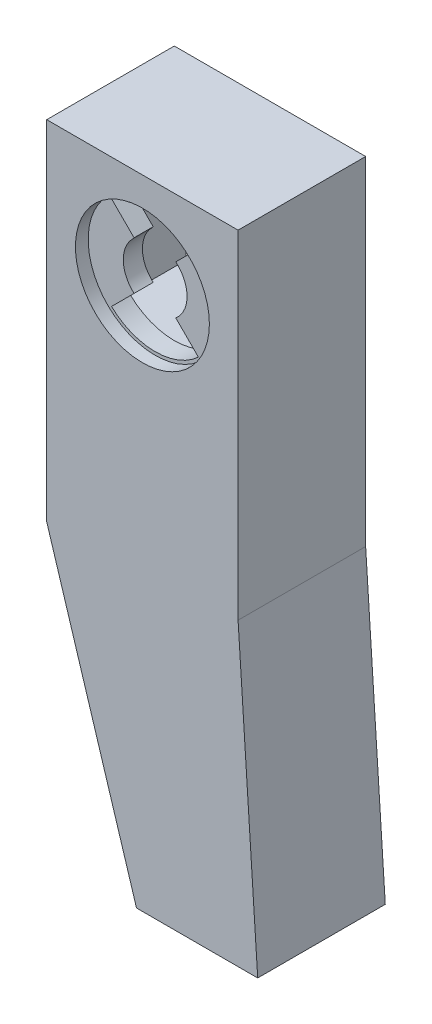
ISO-10303-21;
HEADER;
FILE_DESCRIPTION(('STEP AP214'),'2;1');
FILE_NAME('part.step','',(''),(''),'','','');
FILE_SCHEMA(('AUTOMOTIVE_DESIGN { 1 0 10303 214 1 1 1 1 }'));
ENDSEC;
DATA;
#1=APPLICATION_CONTEXT('core data for automotive mechanical design processes');
#2=APPLICATION_PROTOCOL_DEFINITION('international standard','automotive_design',2000,#1);
#3=PRODUCT_CONTEXT('',#1,'mechanical');
#4=PRODUCT('Part','Part','',(#3));
#5=PRODUCT_RELATED_PRODUCT_CATEGORY('part','',(#4));
#6=PRODUCT_DEFINITION_FORMATION('','',#4);
#7=PRODUCT_DEFINITION_CONTEXT('part definition',#1,'design');
#8=PRODUCT_DEFINITION('design','',#6,#7);
#9=PRODUCT_DEFINITION_SHAPE('','',#8);
#10=(LENGTH_UNIT() NAMED_UNIT(*) SI_UNIT(.MILLI.,.METRE.));
#11=(NAMED_UNIT(*) PLANE_ANGLE_UNIT() SI_UNIT($,.RADIAN.));
#12=(NAMED_UNIT(*) SI_UNIT($,.STERADIAN.) SOLID_ANGLE_UNIT());
#13=UNCERTAINTY_MEASURE_WITH_UNIT(LENGTH_MEASURE(1.E-05),#10,'distance_accuracy_value','');
#14=(GEOMETRIC_REPRESENTATION_CONTEXT(3) GLOBAL_UNCERTAINTY_ASSIGNED_CONTEXT((#13)) GLOBAL_UNIT_ASSIGNED_CONTEXT((#10,
#11,#12)) REPRESENTATION_CONTEXT('',''));
#15=CARTESIAN_POINT('',(0.,0.,0.));
#16=DIRECTION('',(0.,0.,1.));
#17=DIRECTION('',(1.,0.,0.));
#18=AXIS2_PLACEMENT_3D('',#15,#16,#17);
#19=CARTESIAN_POINT('',(-80.192523703358,-80.1925237033575,-5.));
#20=DIRECTION('',(-0.70710678118655,-0.707106781186545,0.));
#21=DIRECTION('',(0.707106781186545,-0.70710678118655,0.));
#22=AXIS2_PLACEMENT_3D('',#19,#20,#21);
#23=PLANE('',#22);
#24=DIRECTION('',(0.,0.,1.));
#25=VECTOR('',#24,1.);
#26=CARTESIAN_POINT('',(-167.861898306231,7.47685089951611,-5.));
#27=LINE('',#26,#25);
#28=CARTESIAN_POINT('',(-167.861898306231,7.47685089951611,-5.));
#29=VERTEX_POINT('',#28);
#30=CARTESIAN_POINT('',(-167.861898306231,7.47685089951611,-2.));
#31=VERTEX_POINT('',#30);
#32=EDGE_CURVE('E192',#29,#31,#27,.T.);
#33=ORIENTED_EDGE('',*,*,#32,.T.);
#34=DIRECTION('',(0.707106781186545,-0.70710678118655,0.));
#35=VECTOR('',#34,1.);
#36=CARTESIAN_POINT('',(-80.192523703358,-80.1925237033575,-2.));
#37=LINE('',#36,#35);
#38=CARTESIAN_POINT('',(-171.403251305948,11.0182038992326,-2.));
#39=VERTEX_POINT('',#38);
#40=EDGE_CURVE('E56',#39,#31,#37,.T.);
#41=ORIENTED_EDGE('',*,*,#40,.F.);
#42=DIRECTION('',(0.,0.,1.));
#43=VECTOR('',#42,1.);
#44=CARTESIAN_POINT('',(-171.403251305948,11.0182038992326,-5.));
#45=LINE('',#44,#43);
#46=CARTESIAN_POINT('',(-171.403251305948,11.0182038992326,-5.));
#47=VERTEX_POINT('',#46);
#48=EDGE_CURVE('E232',#47,#39,#45,.T.);
#49=ORIENTED_EDGE('',*,*,#48,.F.);
#50=DIRECTION('',(0.707106781186545,-0.70710678118655,0.));
#51=VECTOR('',#50,1.);
#52=CARTESIAN_POINT('',(-80.192523703358,-80.1925237033575,-5.));
#53=LINE('',#52,#51);
#54=EDGE_CURVE('E599',#47,#29,#53,.T.);
#55=ORIENTED_EDGE('',*,*,#54,.T.);
#56=EDGE_LOOP('',(#33,#41,#49,#55));
#57=FACE_BOUND('',#56,.T.);
#58=ADVANCED_FACE('F39',(#57),#23,.T.);
#59=CARTESIAN_POINT('',(-174.640703898861,14.8285714285714,-5.));
#60=DIRECTION('',(0.,0.,1.));
#61=DIRECTION('',(1.,0.,0.));
#62=AXIS2_PLACEMENT_3D('',#59,#60,#61);
#63=CYLINDRICAL_SURFACE('',#62,5.);
#64=ORIENTED_EDGE('',*,*,#48,.T.);
#65=CARTESIAN_POINT('',(-174.640703898861,14.8285714285714,-2.));
#66=DIRECTION('',(0.,0.,1.));
#67=DIRECTION('',(1.,0.,0.));
#68=AXIS2_PLACEMENT_3D('',#65,#66,#67);
#69=CIRCLE('',#68,5.);
#70=CARTESIAN_POINT('',(-171.403251305947,18.6389389579103,-2.));
#71=VERTEX_POINT('',#70);
#72=EDGE_CURVE('E586',#71,#39,#69,.F.);
#73=ORIENTED_EDGE('',*,*,#72,.F.);
#74=DIRECTION('',(0.,0.,1.));
#75=VECTOR('',#74,1.);
#76=CARTESIAN_POINT('',(-171.403251305947,18.6389389579103,-5.));
#77=LINE('',#76,#75);
#78=CARTESIAN_POINT('',(-171.403251305947,18.6389389579103,-5.));
#79=VERTEX_POINT('',#78);
#80=EDGE_CURVE('E623',#79,#71,#77,.T.);
#81=ORIENTED_EDGE('',*,*,#80,.F.);
#82=CARTESIAN_POINT('',(-174.640703898861,14.8285714285714,-5.));
#83=DIRECTION('',(0.,0.,1.));
#84=DIRECTION('',(1.,0.,0.));
#85=AXIS2_PLACEMENT_3D('',#82,#83,#84);
#86=CIRCLE('',#85,5.);
#87=EDGE_CURVE('E196',#79,#47,#86,.F.);
#88=ORIENTED_EDGE('',*,*,#87,.T.);
#89=EDGE_LOOP('',(#64,#73,#81,#88));
#90=FACE_BOUND('',#89,.T.);
#91=ADVANCED_FACE('F296',(#90),#63,.F.);
#92=CARTESIAN_POINT('',(-95.0210951319294,95.0210951319288,-5.));
#93=DIRECTION('',(0.70710678118655,-0.707106781186546,0.));
#94=DIRECTION('',(0.707106781186546,0.70710678118655,0.));
#95=AXIS2_PLACEMENT_3D('',#92,#93,#94);
#96=PLANE('',#95);
#97=DIRECTION('',(0.707106781186546,0.70710678118655,0.));
#98=VECTOR('',#97,1.);
#99=CARTESIAN_POINT('',(-95.0210951319294,95.0210951319288,-2.));
#100=LINE('',#99,#98);
#101=CARTESIAN_POINT('',(-167.861898306231,22.1802919576267,-2.));
#102=VERTEX_POINT('',#101);
#103=EDGE_CURVE('E583',#71,#102,#100,.T.);
#104=ORIENTED_EDGE('',*,*,#103,.T.);
#105=DIRECTION('',(0.,0.,1.));
#106=VECTOR('',#105,1.);
#107=CARTESIAN_POINT('',(-167.861898306231,22.1802919576267,-5.));
#108=LINE('',#107,#106);
#109=CARTESIAN_POINT('',(-167.861898306231,22.1802919576267,-5.));
#110=VERTEX_POINT('',#109);
#111=EDGE_CURVE('E626',#110,#102,#108,.T.);
#112=ORIENTED_EDGE('',*,*,#111,.F.);
#113=DIRECTION('',(0.707106781186546,0.70710678118655,0.));
#114=VECTOR('',#113,1.);
#115=CARTESIAN_POINT('',(-95.0210951319294,95.0210951319288,-5.));
#116=LINE('',#115,#114);
#117=EDGE_CURVE('E617',#79,#110,#116,.T.);
#118=ORIENTED_EDGE('',*,*,#117,.F.);
#119=ORIENTED_EDGE('',*,*,#80,.T.);
#120=EDGE_LOOP('',(#104,#112,#118,#119));
#121=FACE_BOUND('',#120,.T.);
#122=ADVANCED_FACE('F302',(#121),#96,.F.);
#123=CARTESIAN_POINT('',(-174.640703898861,14.8285714285714,-5.));
#124=DIRECTION('',(0.,0.,1.));
#125=DIRECTION('',(1.,0.,0.));
#126=AXIS2_PLACEMENT_3D('',#123,#124,#125);
#127=CYLINDRICAL_SURFACE('',#126,9.99999999999999);
#128=ORIENTED_EDGE('',*,*,#111,.T.);
#129=CARTESIAN_POINT('',(-174.640703898861,14.8285714285714,-2.));
#130=DIRECTION('',(0.,0.,1.));
#131=DIRECTION('',(1.,0.,0.));
#132=AXIS2_PLACEMENT_3D('',#129,#130,#131);
#133=CIRCLE('',#132,9.99999999999999);
#134=CARTESIAN_POINT('',(-181.456415011949,22.1460902719308,-2.));
#135=VERTEX_POINT('',#134);
#136=EDGE_CURVE('E581',#135,#102,#133,.F.);
#137=ORIENTED_EDGE('',*,*,#136,.F.);
#138=DIRECTION('',(0.,0.,1.));
#139=VECTOR('',#138,1.);
#140=CARTESIAN_POINT('',(-181.456415011949,22.1460902719308,-5.));
#141=LINE('',#140,#139);
#142=CARTESIAN_POINT('',(-181.456415011949,22.1460902719308,-5.));
#143=VERTEX_POINT('',#142);
#144=EDGE_CURVE('E629',#143,#135,#141,.T.);
#145=ORIENTED_EDGE('',*,*,#144,.F.);
#146=CARTESIAN_POINT('',(-174.640703898861,14.8285714285714,-5.));
#147=DIRECTION('',(0.,0.,1.));
#148=DIRECTION('',(1.,0.,0.));
#149=AXIS2_PLACEMENT_3D('',#146,#147,#148);
#150=CIRCLE('',#149,9.99999999999999);
#151=EDGE_CURVE('E614',#143,#110,#150,.F.);
#152=ORIENTED_EDGE('',*,*,#151,.T.);
#153=EDGE_LOOP('',(#128,#137,#145,#152));
#154=FACE_BOUND('',#153,.T.);
#155=ADVANCED_FACE('F422',(#154),#127,.F.);
#156=CARTESIAN_POINT('',(-79.6551623700086,-79.6551623700092,-5.));
#157=DIRECTION('',(0.707106781186545,0.70710678118655,0.));
#158=DIRECTION('',(-0.70710678118655,0.707106781186545,0.));
#159=AXIS2_PLACEMENT_3D('',#156,#157,#158);
#160=PLANE('',#159);
#161=ORIENTED_EDGE('',*,*,#144,.T.);
#162=DIRECTION('',(-0.70710678118655,0.707106781186545,0.));
#163=VECTOR('',#162,1.);
#164=CARTESIAN_POINT('',(-79.6551623700086,-79.6551623700092,-2.));
#165=LINE('',#164,#163);
#166=CARTESIAN_POINT('',(-177.949263697929,18.6389389579103,-2.));
#167=VERTEX_POINT('',#166);
#168=EDGE_CURVE('E579',#167,#135,#165,.T.);
#169=ORIENTED_EDGE('',*,*,#168,.F.);
#170=DIRECTION('',(0.,0.,1.));
#171=VECTOR('',#170,1.);
#172=CARTESIAN_POINT('',(-177.949263697929,18.6389389579103,-5.));
#173=LINE('',#172,#171);
#174=CARTESIAN_POINT('',(-177.949263697929,18.6389389579103,-5.));
#175=VERTEX_POINT('',#174);
#176=EDGE_CURVE('E632',#175,#167,#173,.T.);
#177=ORIENTED_EDGE('',*,*,#176,.F.);
#178=DIRECTION('',(-0.70710678118655,0.707106781186545,0.));
#179=VECTOR('',#178,1.);
#180=CARTESIAN_POINT('',(-79.6551623700086,-79.6551623700092,-5.));
#181=LINE('',#180,#179);
#182=EDGE_CURVE('E611',#175,#143,#181,.T.);
#183=ORIENTED_EDGE('',*,*,#182,.T.);
#184=EDGE_LOOP('',(#161,#169,#177,#183));
#185=FACE_BOUND('',#184,.T.);
#186=ADVANCED_FACE('F432',(#185),#160,.T.);
#187=CARTESIAN_POINT('',(-114.944868377308,94.9283734474667,-5.));
#188=DIRECTION('',(0.771047654122572,-0.636777445480034,0.));
#189=DIRECTION('',(0.636777445480034,0.771047654122572,0.));
#190=AXIS2_PLACEMENT_3D('',#187,#188,#189);
#191=PLANE('',#190);
#192=ORIENTED_EDGE('',*,*,#176,.T.);
#193=DIRECTION('',(0.636777445480034,0.771047654122572,0.));
#194=VECTOR('',#193,1.);
#195=CARTESIAN_POINT('',(-114.944868377308,94.9283734474667,-2.));
#196=LINE('',#195,#194);
#197=CARTESIAN_POINT('',(-178.176237804793,18.3641053345042,-2.));
#198=VERTEX_POINT('',#197);
#199=EDGE_CURVE('E577',#198,#167,#196,.T.);
#200=ORIENTED_EDGE('',*,*,#199,.F.);
#201=DIRECTION('',(0.,0.,1.));
#202=VECTOR('',#201,1.);
#203=CARTESIAN_POINT('',(-178.176237804793,18.3641053345042,-5.));
#204=LINE('',#203,#202);
#205=CARTESIAN_POINT('',(-178.176237804793,18.3641053345042,-5.));
#206=VERTEX_POINT('',#205);
#207=EDGE_CURVE('E194',#206,#198,#204,.T.);
#208=ORIENTED_EDGE('',*,*,#207,.F.);
#209=DIRECTION('',(0.636777445480034,0.771047654122572,0.));
#210=VECTOR('',#209,1.);
#211=CARTESIAN_POINT('',(-114.944868377308,94.9283734474667,-5.));
#212=LINE('',#211,#210);
#213=EDGE_CURVE('E608',#206,#175,#212,.T.);
#214=ORIENTED_EDGE('',*,*,#213,.T.);
#215=EDGE_LOOP('',(#192,#200,#208,#214));
#216=FACE_BOUND('',#215,.T.);
#217=ADVANCED_FACE('F442',(#216),#191,.T.);
#218=CARTESIAN_POINT('',(-174.640703898861,14.8285714285714,-5.));
#219=DIRECTION('',(0.,0.,1.));
#220=DIRECTION('',(1.,0.,0.));
#221=AXIS2_PLACEMENT_3D('',#218,#219,#220);
#222=CYLINDRICAL_SURFACE('',#221,5.);
#223=ORIENTED_EDGE('',*,*,#207,.T.);
#224=CARTESIAN_POINT('',(-174.640703898861,14.8285714285714,-2.));
#225=DIRECTION('',(0.,0.,1.));
#226=DIRECTION('',(1.,0.,0.));
#227=AXIS2_PLACEMENT_3D('',#224,#225,#226);
#228=CIRCLE('',#227,5.);
#229=CARTESIAN_POINT('',(-177.949263697929,11.0797806827455,-2.));
#230=VERTEX_POINT('',#229);
#231=EDGE_CURVE('E187',#230,#198,#228,.F.);
#232=ORIENTED_EDGE('',*,*,#231,.F.);
#233=DIRECTION('',(0.,0.,1.));
#234=VECTOR('',#233,1.);
#235=CARTESIAN_POINT('',(-177.949263697929,11.0797806827455,-5.));
#236=LINE('',#235,#234);
#237=CARTESIAN_POINT('',(-177.949263697929,11.0797806827455,-5.));
#238=VERTEX_POINT('',#237);
#239=EDGE_CURVE('E186',#238,#230,#236,.T.);
#240=ORIENTED_EDGE('',*,*,#239,.F.);
#241=CARTESIAN_POINT('',(-174.640703898861,14.8285714285714,-5.));
#242=DIRECTION('',(0.,0.,1.));
#243=DIRECTION('',(1.,0.,0.));
#244=AXIS2_PLACEMENT_3D('',#241,#242,#243);
#245=CIRCLE('',#244,5.);
#246=EDGE_CURVE('E605',#238,#206,#245,.F.);
#247=ORIENTED_EDGE('',*,*,#246,.T.);
#248=EDGE_LOOP('',(#223,#232,#240,#247));
#249=FACE_BOUND('',#248,.T.);
#250=ADVANCED_FACE('F452',(#249),#222,.F.);
#251=CARTESIAN_POINT('',(-94.514522190337,94.5145221903371,-5.));
#252=DIRECTION('',(-0.707106781186547,0.707106781186548,0.));
#253=DIRECTION('',(-0.707106781186548,-0.707106781186547,0.));
#254=AXIS2_PLACEMENT_3D('',#251,#252,#253);
#255=PLANE('',#254);
#256=DIRECTION('',(-0.707106781186548,-0.707106781186547,0.));
#257=VECTOR('',#256,1.);
#258=CARTESIAN_POINT('',(-94.514522190337,94.5145221903371,-2.));
#259=LINE('',#258,#257);
#260=CARTESIAN_POINT('',(-181.488229416532,7.54081496414187,-2.));
#261=VERTEX_POINT('',#260);
#262=EDGE_CURVE('E173',#230,#261,#259,.T.);
#263=ORIENTED_EDGE('',*,*,#262,.T.);
#264=DIRECTION('',(0.,0.,1.));
#265=VECTOR('',#264,1.);
#266=CARTESIAN_POINT('',(-181.488229416532,7.54081496414187,-5.));
#267=LINE('',#266,#265);
#268=CARTESIAN_POINT('',(-181.488229416532,7.54081496414187,-5.));
#269=VERTEX_POINT('',#268);
#270=EDGE_CURVE('E184',#269,#261,#267,.T.);
#271=ORIENTED_EDGE('',*,*,#270,.F.);
#272=DIRECTION('',(-0.707106781186548,-0.707106781186547,0.));
#273=VECTOR('',#272,1.);
#274=CARTESIAN_POINT('',(-94.514522190337,94.5145221903371,-5.));
#275=LINE('',#274,#273);
#276=EDGE_CURVE('E603',#238,#269,#275,.T.);
#277=ORIENTED_EDGE('',*,*,#276,.F.);
#278=ORIENTED_EDGE('',*,*,#239,.T.);
#279=EDGE_LOOP('',(#263,#271,#277,#278));
#280=FACE_BOUND('',#279,.T.);
#281=ADVANCED_FACE('F182',(#280),#255,.F.);
#282=CARTESIAN_POINT('',(-174.640703898861,14.8285714285714,-5.));
#283=DIRECTION('',(0.,0.,1.));
#284=DIRECTION('',(1.,0.,0.));
#285=AXIS2_PLACEMENT_3D('',#282,#283,#284);
#286=CYLINDRICAL_SURFACE('',#285,10.);
#287=ORIENTED_EDGE('',*,*,#270,.T.);
#288=CARTESIAN_POINT('',(-174.640703898861,14.8285714285714,-2.));
#289=DIRECTION('',(0.,0.,1.));
#290=DIRECTION('',(1.,0.,0.));
#291=AXIS2_PLACEMENT_3D('',#288,#289,#290);
#292=CIRCLE('',#291,10.);
#293=EDGE_CURVE('E169',#31,#261,#292,.F.);
#294=ORIENTED_EDGE('',*,*,#293,.F.);
#295=ORIENTED_EDGE('',*,*,#32,.F.);
#296=CARTESIAN_POINT('',(-174.640703898861,14.8285714285714,-5.));
#297=DIRECTION('',(0.,0.,1.));
#298=DIRECTION('',(1.,0.,0.));
#299=AXIS2_PLACEMENT_3D('',#296,#297,#298);
#300=CIRCLE('',#299,10.);
#301=EDGE_CURVE('E191',#29,#269,#300,.F.);
#302=ORIENTED_EDGE('',*,*,#301,.T.);
#303=EDGE_LOOP('',(#287,#294,#295,#302));
#304=FACE_BOUND('',#303,.T.);
#305=ADVANCED_FACE('F189',(#304),#286,.F.);
#306=CARTESIAN_POINT('',(0.,28.0285714285714,-20.));
#307=DIRECTION('',(0.,1.,0.));
#308=DIRECTION('',(-1.,0.,0.));
#309=AXIS2_PLACEMENT_3D('',#306,#307,#308);
#310=PLANE('',#309);
#311=DIRECTION('',(-1.,0.,0.));
#312=VECTOR('',#311,1.);
#313=CARTESIAN_POINT('',(0.,28.0285714285714,-5.));
#314=LINE('',#313,#312);
#315=CARTESIAN_POINT('',(-161.440703898861,28.0285714285714,-5.));
#316=VERTEX_POINT('',#315);
#317=CARTESIAN_POINT('',(-187.840703898861,28.0285714285714,-5.));
#318=VERTEX_POINT('',#317);
#319=EDGE_CURVE('E64',#316,#318,#314,.T.);
#320=ORIENTED_EDGE('',*,*,#319,.T.);
#321=DIRECTION('',(0.,0.,1.));
#322=VECTOR('',#321,1.);
#323=CARTESIAN_POINT('',(-187.840703898861,28.0285714285714,-20.));
#324=LINE('',#323,#322);
#325=CARTESIAN_POINT('',(-187.840703898861,28.0285714285714,-20.));
#326=VERTEX_POINT('',#325);
#327=EDGE_CURVE('E11',#326,#318,#324,.T.);
#328=ORIENTED_EDGE('',*,*,#327,.F.);
#329=DIRECTION('',(-1.,0.,0.));
#330=VECTOR('',#329,1.);
#331=CARTESIAN_POINT('',(0.,28.0285714285714,-20.));
#332=LINE('',#331,#330);
#333=CARTESIAN_POINT('',(-161.440703898861,28.0285714285714,-20.));
#334=VERTEX_POINT('',#333);
#335=EDGE_CURVE('E217',#334,#326,#332,.T.);
#336=ORIENTED_EDGE('',*,*,#335,.F.);
#337=DIRECTION('',(0.,0.,1.));
#338=VECTOR('',#337,1.);
#339=CARTESIAN_POINT('',(-161.440703898861,28.0285714285714,-20.));
#340=LINE('',#339,#338);
#341=EDGE_CURVE('E250',#334,#316,#340,.T.);
#342=ORIENTED_EDGE('',*,*,#341,.T.);
#343=EDGE_LOOP('',(#320,#328,#336,#342));
#344=FACE_BOUND('',#343,.T.);
#345=ADVANCED_FACE('F316',(#344),#310,.F.);
#346=CARTESIAN_POINT('',(-187.840703898861,0.,-20.));
#347=DIRECTION('',(-1.,0.,0.));
#348=DIRECTION('',(0.,0.,1.));
#349=AXIS2_PLACEMENT_3D('',#346,#347,#348);
#350=PLANE('',#349);
#351=DIRECTION('',(0.,-1.,0.));
#352=VECTOR('',#351,1.);
#353=CARTESIAN_POINT('',(-187.840703898861,0.,-5.));
#354=LINE('',#353,#352);
#355=CARTESIAN_POINT('',(-187.840703898861,1.62857142857143,-5.));
#356=VERTEX_POINT('',#355);
#357=EDGE_CURVE('E594',#318,#356,#354,.T.);
#358=ORIENTED_EDGE('',*,*,#357,.T.);
#359=DIRECTION('',(0.,0.,1.));
#360=VECTOR('',#359,1.);
#361=CARTESIAN_POINT('',(-187.840703898861,1.62857142857143,-20.));
#362=LINE('',#361,#360);
#363=CARTESIAN_POINT('',(-187.840703898861,1.62857142857143,-20.));
#364=VERTEX_POINT('',#363);
#365=EDGE_CURVE('E48',#364,#356,#362,.T.);
#366=ORIENTED_EDGE('',*,*,#365,.F.);
#367=DIRECTION('',(0.,-1.,0.));
#368=VECTOR('',#367,1.);
#369=CARTESIAN_POINT('',(-187.840703898861,0.,-20.));
#370=LINE('',#369,#368);
#371=EDGE_CURVE('E226',#326,#364,#370,.T.);
#372=ORIENTED_EDGE('',*,*,#371,.F.);
#373=ORIENTED_EDGE('',*,*,#327,.T.);
#374=EDGE_LOOP('',(#358,#366,#372,#373));
#375=FACE_BOUND('',#374,.T.);
#376=ADVANCED_FACE('F312',(#375),#350,.F.);
#377=CARTESIAN_POINT('',(0.,1.62857142857143,-20.));
#378=DIRECTION('',(0.,1.,0.));
#379=DIRECTION('',(0.,0.,1.));
#380=AXIS2_PLACEMENT_3D('',#377,#378,#379);
#381=PLANE('',#380);
#382=ORIENTED_EDGE('',*,*,#365,.T.);
#383=DIRECTION('',(-1.,0.,0.));
#384=VECTOR('',#383,1.);
#385=CARTESIAN_POINT('',(0.,1.62857142857143,-5.));
#386=LINE('',#385,#384);
#387=CARTESIAN_POINT('',(-161.440703898861,1.62857142857143,-5.));
#388=VERTEX_POINT('',#387);
#389=EDGE_CURVE('E597',#388,#356,#386,.T.);
#390=ORIENTED_EDGE('',*,*,#389,.F.);
#391=DIRECTION('',(0.,0.,1.));
#392=VECTOR('',#391,1.);
#393=CARTESIAN_POINT('',(-161.440703898861,1.62857142857143,-20.));
#394=LINE('',#393,#392);
#395=CARTESIAN_POINT('',(-161.440703898861,1.62857142857143,-20.));
#396=VERTEX_POINT('',#395);
#397=EDGE_CURVE('E247',#396,#388,#394,.T.);
#398=ORIENTED_EDGE('',*,*,#397,.F.);
#399=DIRECTION('',(-1.,0.,0.));
#400=VECTOR('',#399,1.);
#401=CARTESIAN_POINT('',(0.,1.62857142857143,-20.));
#402=LINE('',#401,#400);
#403=EDGE_CURVE('E223',#396,#364,#402,.T.);
#404=ORIENTED_EDGE('',*,*,#403,.T.);
#405=EDGE_LOOP('',(#382,#390,#398,#404));
#406=FACE_BOUND('',#405,.T.);
#407=ADVANCED_FACE('F315',(#406),#381,.T.);
#408=CARTESIAN_POINT('',(-161.440703898861,0.,-20.));
#409=DIRECTION('',(-1.,0.,0.));
#410=DIRECTION('',(0.,0.,1.));
#411=AXIS2_PLACEMENT_3D('',#408,#409,#410);
#412=PLANE('',#411);
#413=ORIENTED_EDGE('',*,*,#397,.T.);
#414=DIRECTION('',(0.,-1.,0.));
#415=VECTOR('',#414,1.);
#416=CARTESIAN_POINT('',(-161.440703898861,0.,-5.));
#417=LINE('',#416,#415);
#418=EDGE_CURVE('E590',#316,#388,#417,.T.);
#419=ORIENTED_EDGE('',*,*,#418,.F.);
#420=ORIENTED_EDGE('',*,*,#341,.F.);
#421=DIRECTION('',(0.,-1.,0.));
#422=VECTOR('',#421,1.);
#423=CARTESIAN_POINT('',(-161.440703898861,0.,-20.));
#424=LINE('',#423,#422);
#425=EDGE_CURVE('E220',#334,#396,#424,.T.);
#426=ORIENTED_EDGE('',*,*,#425,.T.);
#427=EDGE_LOOP('',(#413,#419,#420,#426));
#428=FACE_BOUND('',#427,.T.);
#429=ADVANCED_FACE('F320',(#428),#412,.T.);
#430=CARTESIAN_POINT('',(-159.640703898861,0.,-20.));
#431=DIRECTION('',(-1.,0.,0.));
#432=DIRECTION('',(0.,0.,1.));
#433=AXIS2_PLACEMENT_3D('',#430,#431,#432);
#434=PLANE('',#433);
#435=DIRECTION('',(0.,-1.,0.));
#436=VECTOR('',#435,1.);
#437=CARTESIAN_POINT('',(-159.640703898861,0.,0.));
#438=LINE('',#437,#436);
#439=CARTESIAN_POINT('',(-159.640703898861,29.8285714285714,0.));
#440=VERTEX_POINT('',#439);
#441=CARTESIAN_POINT('',(-159.640703898861,-23.1318478083269,0.));
#442=VERTEX_POINT('',#441);
#443=EDGE_CURVE('E228',#440,#442,#438,.T.);
#444=ORIENTED_EDGE('',*,*,#443,.T.);
#445=DIRECTION('',(0.,0.,1.));
#446=VECTOR('',#445,1.);
#447=CARTESIAN_POINT('',(-159.640703898861,-23.1318478083269,-20.));
#448=LINE('',#447,#446);
#449=CARTESIAN_POINT('',(-159.640703898861,-23.1318478083269,-20.));
#450=VERTEX_POINT('',#449);
#451=EDGE_CURVE('E253',#450,#442,#448,.T.);
#452=ORIENTED_EDGE('',*,*,#451,.F.);
#453=DIRECTION('',(0.,-1.,0.));
#454=VECTOR('',#453,1.);
#455=CARTESIAN_POINT('',(-159.640703898861,0.,-20.));
#456=LINE('',#455,#454);
#457=CARTESIAN_POINT('',(-159.640703898861,29.8285714285714,-20.));
#458=VERTEX_POINT('',#457);
#459=EDGE_CURVE('E200',#458,#450,#456,.T.);
#460=ORIENTED_EDGE('',*,*,#459,.F.);
#461=DIRECTION('',(0.,0.,1.));
#462=VECTOR('',#461,1.);
#463=CARTESIAN_POINT('',(-159.640703898861,29.8285714285714,-20.));
#464=LINE('',#463,#462);
#465=EDGE_CURVE('E43',#458,#440,#464,.T.);
#466=ORIENTED_EDGE('',*,*,#465,.T.);
#467=EDGE_LOOP('',(#444,#452,#460,#466));
#468=FACE_BOUND('',#467,.T.);
#469=ADVANCED_FACE('F41',(#468),#434,.F.);
#470=CARTESIAN_POINT('',(-160.467189360171,-10.4950379469478,-20.));
#471=DIRECTION('',(-0.997868060017081,-0.0652635794126135,0.));
#472=DIRECTION('',(0.0652635794126135,-0.997868060017081,0.));
#473=AXIS2_PLACEMENT_3D('',#470,#471,#472);
#474=PLANE('',#473);
#475=DIRECTION('',(0.0652635794126135,-0.997868060017081,0.));
#476=VECTOR('',#475,1.);
#477=CARTESIAN_POINT('',(-160.467189360171,-10.4950379469478,0.));
#478=LINE('',#477,#476);
#479=CARTESIAN_POINT('',(-156.564173506039,-70.1714285714286,0.));
#480=VERTEX_POINT('',#479);
#481=EDGE_CURVE('E204',#442,#480,#478,.T.);
#482=ORIENTED_EDGE('',*,*,#481,.T.);
#483=DIRECTION('',(0.,0.,1.));
#484=VECTOR('',#483,1.);
#485=CARTESIAN_POINT('',(-156.564173506039,-70.1714285714286,-20.));
#486=LINE('',#485,#484);
#487=CARTESIAN_POINT('',(-156.564173506039,-70.1714285714286,-20.));
#488=VERTEX_POINT('',#487);
#489=EDGE_CURVE('E256',#488,#480,#486,.T.);
#490=ORIENTED_EDGE('',*,*,#489,.F.);
#491=DIRECTION('',(0.0652635794126135,-0.997868060017081,0.));
#492=VECTOR('',#491,1.);
#493=CARTESIAN_POINT('',(-160.467189360171,-10.4950379469478,-20.));
#494=LINE('',#493,#492);
#495=EDGE_CURVE('E215',#450,#488,#494,.T.);
#496=ORIENTED_EDGE('',*,*,#495,.F.);
#497=ORIENTED_EDGE('',*,*,#451,.T.);
#498=EDGE_LOOP('',(#482,#490,#496,#497));
#499=FACE_BOUND('',#498,.T.);
#500=ADVANCED_FACE('F277',(#499),#474,.F.);
#501=CARTESIAN_POINT('',(-1.0250781009321E-13,-70.1714285714288,-20.));
#502=DIRECTION('',(0.,-1.,0.));
#503=DIRECTION('',(1.,0.,0.));
#504=AXIS2_PLACEMENT_3D('',#501,#502,#503);
#505=PLANE('',#504);
#506=CARTESIAN_POINT('',(-161.564173506039,-70.1714285714286,-12.));
#507=DIRECTION('',(0.,-1.,0.));
#508=DIRECTION('',(1.,0.,0.));
#509=AXIS2_PLACEMENT_3D('',#506,#507,#508);
#510=CIRCLE('',#509,1.4);
#511=CARTESIAN_POINT('',(-160.164173506039,-70.1714285714286,-12.));
#512=VERTEX_POINT('',#511);
#513=EDGE_CURVE('E562',#512,#512,#510,.T.);
#514=ORIENTED_EDGE('',*,*,#513,.F.);
#515=EDGE_LOOP('',(#514));
#516=FACE_BOUND('',#515,.T.);
#517=CARTESIAN_POINT('',(-170.564173506039,-70.1714285714286,-12.));
#518=DIRECTION('',(0.,-1.,0.));
#519=DIRECTION('',(1.,0.,0.));
#520=AXIS2_PLACEMENT_3D('',#517,#518,#519);
#521=CIRCLE('',#520,1.4);
#522=CARTESIAN_POINT('',(-169.164173506039,-70.1714285714286,-12.));
#523=VERTEX_POINT('',#522);
#524=EDGE_CURVE('E567',#523,#523,#521,.T.);
#525=ORIENTED_EDGE('',*,*,#524,.F.);
#526=EDGE_LOOP('',(#525));
#527=FACE_BOUND('',#526,.T.);
#528=DIRECTION('',(1.,0.,0.));
#529=VECTOR('',#528,1.);
#530=CARTESIAN_POINT('',(-1.0250781009321E-13,-70.1714285714288,0.));
#531=LINE('',#530,#529);
#532=CARTESIAN_POINT('',(-175.564173506039,-70.1714285714286,0.));
#533=VERTEX_POINT('',#532);
#534=EDGE_CURVE('E240',#533,#480,#531,.T.);
#535=ORIENTED_EDGE('',*,*,#534,.F.);
#536=DIRECTION('',(0.,0.,1.));
#537=VECTOR('',#536,1.);
#538=CARTESIAN_POINT('',(-175.564173506039,-70.1714285714286,-20.));
#539=LINE('',#538,#537);
#540=CARTESIAN_POINT('',(-175.564173506039,-70.1714285714286,-20.));
#541=VERTEX_POINT('',#540);
#542=EDGE_CURVE('E258',#541,#533,#539,.T.);
#543=ORIENTED_EDGE('',*,*,#542,.F.);
#544=DIRECTION('',(1.,0.,0.));
#545=VECTOR('',#544,1.);
#546=CARTESIAN_POINT('',(-1.0250781009321E-13,-70.1714285714288,-20.));
#547=LINE('',#546,#545);
#548=EDGE_CURVE('E212',#541,#488,#547,.T.);
#549=ORIENTED_EDGE('',*,*,#548,.T.);
#550=ORIENTED_EDGE('',*,*,#489,.T.);
#551=EDGE_LOOP('',(#535,#543,#549,#550));
#552=FACE_BOUND('',#551,.T.);
#553=ADVANCED_FACE('F330',(#516,#527,#552),#505,.T.);
#554=CARTESIAN_POINT('',(-180.015866184583,-55.8132812780832,-20.));
#555=DIRECTION('',(-0.955144776013343,-0.29613925247157,0.));
#556=DIRECTION('',(0.29613925247157,-0.955144776013343,0.));
#557=AXIS2_PLACEMENT_3D('',#554,#555,#556);
#558=PLANE('',#557);
#559=DIRECTION('',(0.29613925247157,-0.955144776013343,0.));
#560=VECTOR('',#559,1.);
#561=CARTESIAN_POINT('',(-180.015866184583,-55.8132812780832,0.));
#562=LINE('',#561,#560);
#563=CARTESIAN_POINT('',(-189.640703898861,-24.7700697279648,0.));
#564=VERTEX_POINT('',#563);
#565=EDGE_CURVE('E237',#564,#533,#562,.T.);
#566=ORIENTED_EDGE('',*,*,#565,.F.);
#567=DIRECTION('',(0.,0.,1.));
#568=VECTOR('',#567,1.);
#569=CARTESIAN_POINT('',(-189.640703898861,-24.7700697279648,-20.));
#570=LINE('',#569,#568);
#571=CARTESIAN_POINT('',(-189.640703898861,-24.7700697279648,-20.));
#572=VERTEX_POINT('',#571);
#573=EDGE_CURVE('E260',#572,#564,#570,.T.);
#574=ORIENTED_EDGE('',*,*,#573,.F.);
#575=DIRECTION('',(0.29613925247157,-0.955144776013343,0.));
#576=VECTOR('',#575,1.);
#577=CARTESIAN_POINT('',(-180.015866184583,-55.8132812780832,-20.));
#578=LINE('',#577,#576);
#579=EDGE_CURVE('E209',#572,#541,#578,.T.);
#580=ORIENTED_EDGE('',*,*,#579,.T.);
#581=ORIENTED_EDGE('',*,*,#542,.T.);
#582=EDGE_LOOP('',(#566,#574,#580,#581));
#583=FACE_BOUND('',#582,.T.);
#584=ADVANCED_FACE('F292',(#583),#558,.T.);
#585=CARTESIAN_POINT('',(-189.640703898861,0.,-20.));
#586=DIRECTION('',(-1.,0.,0.));
#587=DIRECTION('',(0.,0.,1.));
#588=AXIS2_PLACEMENT_3D('',#585,#586,#587);
#589=PLANE('',#588);
#590=DIRECTION('',(0.,-1.,0.));
#591=VECTOR('',#590,1.);
#592=CARTESIAN_POINT('',(-189.640703898861,0.,0.));
#593=LINE('',#592,#591);
#594=CARTESIAN_POINT('',(-189.640703898861,29.8285714285714,0.));
#595=VERTEX_POINT('',#594);
#596=EDGE_CURVE('E234',#595,#564,#593,.T.);
#597=ORIENTED_EDGE('',*,*,#596,.F.);
#598=DIRECTION('',(0.,0.,1.));
#599=VECTOR('',#598,1.);
#600=CARTESIAN_POINT('',(-189.640703898861,29.8285714285714,-20.));
#601=LINE('',#600,#599);
#602=CARTESIAN_POINT('',(-189.640703898861,29.8285714285714,-20.));
#603=VERTEX_POINT('',#602);
#604=EDGE_CURVE('E261',#603,#595,#601,.T.);
#605=ORIENTED_EDGE('',*,*,#604,.F.);
#606=DIRECTION('',(0.,-1.,0.));
#607=VECTOR('',#606,1.);
#608=CARTESIAN_POINT('',(-189.640703898861,0.,-20.));
#609=LINE('',#608,#607);
#610=EDGE_CURVE('E206',#603,#572,#609,.T.);
#611=ORIENTED_EDGE('',*,*,#610,.T.);
#612=ORIENTED_EDGE('',*,*,#573,.T.);
#613=EDGE_LOOP('',(#597,#605,#611,#612));
#614=FACE_BOUND('',#613,.T.);
#615=ADVANCED_FACE('F286',(#614),#589,.T.);
#616=CARTESIAN_POINT('',(0.,29.8285714285714,-20.));
#617=DIRECTION('',(0.,-1.,0.));
#618=DIRECTION('',(0.,0.,-1.));
#619=AXIS2_PLACEMENT_3D('',#616,#617,#618);
#620=PLANE('',#619);
#621=DIRECTION('',(1.,0.,0.));
#622=VECTOR('',#621,1.);
#623=CARTESIAN_POINT('',(0.,29.8285714285714,0.));
#624=LINE('',#623,#622);
#625=EDGE_CURVE('E231',#595,#440,#624,.T.);
#626=ORIENTED_EDGE('',*,*,#625,.T.);
#627=ORIENTED_EDGE('',*,*,#465,.F.);
#628=DIRECTION('',(1.,0.,0.));
#629=VECTOR('',#628,1.);
#630=CARTESIAN_POINT('',(0.,29.8285714285714,-20.));
#631=LINE('',#630,#629);
#632=EDGE_CURVE('E203',#603,#458,#631,.T.);
#633=ORIENTED_EDGE('',*,*,#632,.F.);
#634=ORIENTED_EDGE('',*,*,#604,.T.);
#635=EDGE_LOOP('',(#626,#627,#633,#634));
#636=FACE_BOUND('',#635,.T.);
#637=ADVANCED_FACE('F284',(#636),#620,.F.);
#638=CARTESIAN_POINT('',(0.,0.,-20.));
#639=DIRECTION('',(0.,0.,1.));
#640=DIRECTION('',(1.,0.,0.));
#641=AXIS2_PLACEMENT_3D('',#638,#639,#640);
#642=PLANE('',#641);
#643=ORIENTED_EDGE('',*,*,#459,.T.);
#644=ORIENTED_EDGE('',*,*,#495,.T.);
#645=ORIENTED_EDGE('',*,*,#548,.F.);
#646=ORIENTED_EDGE('',*,*,#579,.F.);
#647=ORIENTED_EDGE('',*,*,#610,.F.);
#648=ORIENTED_EDGE('',*,*,#632,.T.);
#649=EDGE_LOOP('',(#643,#644,#645,#646,#647,#648));
#650=FACE_BOUND('',#649,.T.);
#651=ORIENTED_EDGE('',*,*,#335,.T.);
#652=ORIENTED_EDGE('',*,*,#371,.T.);
#653=ORIENTED_EDGE('',*,*,#403,.F.);
#654=ORIENTED_EDGE('',*,*,#425,.F.);
#655=EDGE_LOOP('',(#651,#652,#653,#654));
#656=FACE_BOUND('',#655,.T.);
#657=ADVANCED_FACE('F280',(#650,#656),#642,.F.);
#658=CARTESIAN_POINT('',(0.,0.,0.));
#659=DIRECTION('',(0.,0.,1.));
#660=DIRECTION('',(1.,0.,0.));
#661=AXIS2_PLACEMENT_3D('',#658,#659,#660);
#662=PLANE('',#661);
#663=CARTESIAN_POINT('',(-174.640703898861,14.8285714285714,0.));
#664=DIRECTION('',(0.,0.,1.));
#665=DIRECTION('',(1.,0.,0.));
#666=AXIS2_PLACEMENT_3D('',#663,#664,#665);
#667=CIRCLE('',#666,10.5);
#668=CARTESIAN_POINT('',(-164.140703898861,14.8285714285714,0.));
#669=VERTEX_POINT('',#668);
#670=EDGE_CURVE('E561',#669,#669,#667,.T.);
#671=ORIENTED_EDGE('',*,*,#670,.F.);
#672=EDGE_LOOP('',(#671));
#673=FACE_BOUND('',#672,.T.);
#674=ORIENTED_EDGE('',*,*,#443,.F.);
#675=ORIENTED_EDGE('',*,*,#625,.F.);
#676=ORIENTED_EDGE('',*,*,#596,.T.);
#677=ORIENTED_EDGE('',*,*,#565,.T.);
#678=ORIENTED_EDGE('',*,*,#534,.T.);
#679=ORIENTED_EDGE('',*,*,#481,.F.);
#680=EDGE_LOOP('',(#674,#675,#676,#677,#678,#679));
#681=FACE_BOUND('',#680,.T.);
#682=ADVANCED_FACE('F272',(#673,#681),#662,.T.);
#683=CARTESIAN_POINT('',(0.,0.,-5.));
#684=DIRECTION('',(0.,0.,1.));
#685=DIRECTION('',(1.,0.,0.));
#686=AXIS2_PLACEMENT_3D('',#683,#684,#685);
#687=PLANE('',#686);
#688=ORIENTED_EDGE('',*,*,#418,.T.);
#689=ORIENTED_EDGE('',*,*,#389,.T.);
#690=ORIENTED_EDGE('',*,*,#357,.F.);
#691=ORIENTED_EDGE('',*,*,#319,.F.);
#692=EDGE_LOOP('',(#688,#689,#690,#691));
#693=FACE_BOUND('',#692,.T.);
#694=ORIENTED_EDGE('',*,*,#54,.F.);
#695=ORIENTED_EDGE('',*,*,#87,.F.);
#696=ORIENTED_EDGE('',*,*,#117,.T.);
#697=ORIENTED_EDGE('',*,*,#151,.F.);
#698=ORIENTED_EDGE('',*,*,#182,.F.);
#699=ORIENTED_EDGE('',*,*,#213,.F.);
#700=ORIENTED_EDGE('',*,*,#246,.F.);
#701=ORIENTED_EDGE('',*,*,#276,.T.);
#702=ORIENTED_EDGE('',*,*,#301,.F.);
#703=EDGE_LOOP('',(#694,#695,#696,#697,#698,#699,#700,#701,#702));
#704=FACE_BOUND('',#703,.T.);
#705=ADVANCED_FACE('F310',(#693,#704),#687,.F.);
#706=CARTESIAN_POINT('',(-174.640703898861,14.8285714285714,-2.));
#707=DIRECTION('',(0.,0.,1.));
#708=DIRECTION('',(1.,0.,0.));
#709=AXIS2_PLACEMENT_3D('',#706,#707,#708);
#710=CYLINDRICAL_SURFACE('',#709,10.5);
#711=CARTESIAN_POINT('',(-174.640703898861,14.8285714285714,-2.));
#712=DIRECTION('',(0.,0.,1.));
#713=DIRECTION('',(1.,0.,0.));
#714=AXIS2_PLACEMENT_3D('',#711,#712,#713);
#715=CIRCLE('',#714,10.5);
#716=CARTESIAN_POINT('',(-164.140703898861,14.8285714285714,-2.));
#717=VERTEX_POINT('',#716);
#718=EDGE_CURVE('E588',#717,#717,#715,.T.);
#719=ORIENTED_EDGE('',*,*,#718,.F.);
#720=EDGE_LOOP('',(#719));
#721=FACE_BOUND('',#720,.T.);
#722=ORIENTED_EDGE('',*,*,#670,.T.);
#723=EDGE_LOOP('',(#722));
#724=FACE_BOUND('',#723,.T.);
#725=ADVANCED_FACE('F398',(#721,#724),#710,.F.);
#726=CARTESIAN_POINT('',(0.,0.,-2.));
#727=DIRECTION('',(0.,0.,1.));
#728=DIRECTION('',(1.,0.,0.));
#729=AXIS2_PLACEMENT_3D('',#726,#727,#728);
#730=PLANE('',#729);
#731=ORIENTED_EDGE('',*,*,#40,.T.);
#732=ORIENTED_EDGE('',*,*,#293,.T.);
#733=ORIENTED_EDGE('',*,*,#262,.F.);
#734=ORIENTED_EDGE('',*,*,#231,.T.);
#735=ORIENTED_EDGE('',*,*,#199,.T.);
#736=ORIENTED_EDGE('',*,*,#168,.T.);
#737=ORIENTED_EDGE('',*,*,#136,.T.);
#738=ORIENTED_EDGE('',*,*,#103,.F.);
#739=ORIENTED_EDGE('',*,*,#72,.T.);
#740=EDGE_LOOP('',(#731,#732,#733,#734,#735,#736,#737,#738,#739));
#741=FACE_BOUND('',#740,.T.);
#742=ORIENTED_EDGE('',*,*,#718,.T.);
#743=EDGE_LOOP('',(#742));
#744=FACE_BOUND('',#743,.T.);
#745=ADVANCED_FACE('F171',(#741,#744),#730,.T.);
#746=CARTESIAN_POINT('',(-170.564173506039,-55.1714285714286,-12.));
#747=DIRECTION('',(0.,-1.,0.));
#748=DIRECTION('',(1.,0.,0.));
#749=AXIS2_PLACEMENT_3D('',#746,#747,#748);
#750=CYLINDRICAL_SURFACE('',#749,1.4);
#751=CARTESIAN_POINT('',(-170.564173506039,-55.1714285714286,-12.));
#752=DIRECTION('',(0.,-1.,0.));
#753=DIRECTION('',(1.,0.,0.));
#754=AXIS2_PLACEMENT_3D('',#751,#752,#753);
#755=CIRCLE('',#754,1.4);
#756=CARTESIAN_POINT('',(-169.164173506039,-55.1714285714286,-12.));
#757=VERTEX_POINT('',#756);
#758=EDGE_CURVE('E572',#757,#757,#755,.T.);
#759=ORIENTED_EDGE('',*,*,#758,.F.);
#760=EDGE_LOOP('',(#759));
#761=FACE_BOUND('',#760,.T.);
#762=ORIENTED_EDGE('',*,*,#524,.T.);
#763=EDGE_LOOP('',(#762));
#764=FACE_BOUND('',#763,.T.);
#765=ADVANCED_FACE('F497',(#761,#764),#750,.F.);
#766=CARTESIAN_POINT('',(-170.564173506039,-55.1714285714286,-12.));
#767=DIRECTION('',(0.,-1.,0.));
#768=DIRECTION('',(1.,0.,0.));
#769=AXIS2_PLACEMENT_3D('',#766,#767,#768);
#770=PLANE('',#769);
#771=ORIENTED_EDGE('',*,*,#758,.T.);
#772=EDGE_LOOP('',(#771));
#773=FACE_BOUND('',#772,.T.);
#774=ADVANCED_FACE('F514',(#773),#770,.T.);
#775=CARTESIAN_POINT('',(-161.564173506039,-55.1714285714286,-12.));
#776=DIRECTION('',(0.,-1.,0.));
#777=DIRECTION('',(1.,0.,0.));
#778=AXIS2_PLACEMENT_3D('',#775,#776,#777);
#779=CYLINDRICAL_SURFACE('',#778,1.4);
#780=CARTESIAN_POINT('',(-161.564173506039,-55.1714285714286,-12.));
#781=DIRECTION('',(0.,-1.,0.));
#782=DIRECTION('',(1.,0.,0.));
#783=AXIS2_PLACEMENT_3D('',#780,#781,#782);
#784=CIRCLE('',#783,1.4);
#785=CARTESIAN_POINT('',(-160.164173506039,-55.1714285714286,-12.));
#786=VERTEX_POINT('',#785);
#787=EDGE_CURVE('E560',#786,#786,#784,.T.);
#788=ORIENTED_EDGE('',*,*,#787,.F.);
#789=EDGE_LOOP('',(#788));
#790=FACE_BOUND('',#789,.T.);
#791=ORIENTED_EDGE('',*,*,#513,.T.);
#792=EDGE_LOOP('',(#791));
#793=FACE_BOUND('',#792,.T.);
#794=ADVANCED_FACE('F525',(#790,#793),#779,.F.);
#795=CARTESIAN_POINT('',(-161.564173506039,-55.1714285714286,-12.));
#796=DIRECTION('',(0.,-1.,0.));
#797=DIRECTION('',(1.,0.,0.));
#798=AXIS2_PLACEMENT_3D('',#795,#796,#797);
#799=PLANE('',#798);
#800=ORIENTED_EDGE('',*,*,#787,.T.);
#801=EDGE_LOOP('',(#800));
#802=FACE_BOUND('',#801,.T.);
#803=ADVANCED_FACE('F536',(#802),#799,.T.);
#804=CLOSED_SHELL('',(#58,#91,#122,#155,#186,#217,#250,#281,#305,#345,#376,#407,#429,#469,#500,
#553,#584,#615,#637,#657,#682,#705,#725,#745,#765,#774,#794,#803));
#805=MANIFOLD_SOLID_BREP('B2',#804);
#806=ADVANCED_BREP_SHAPE_REPRESENTATION('',(#18,#805),#14);
#807=SHAPE_DEFINITION_REPRESENTATION(#9,#806);
ENDSEC;
END-ISO-10303-21;
